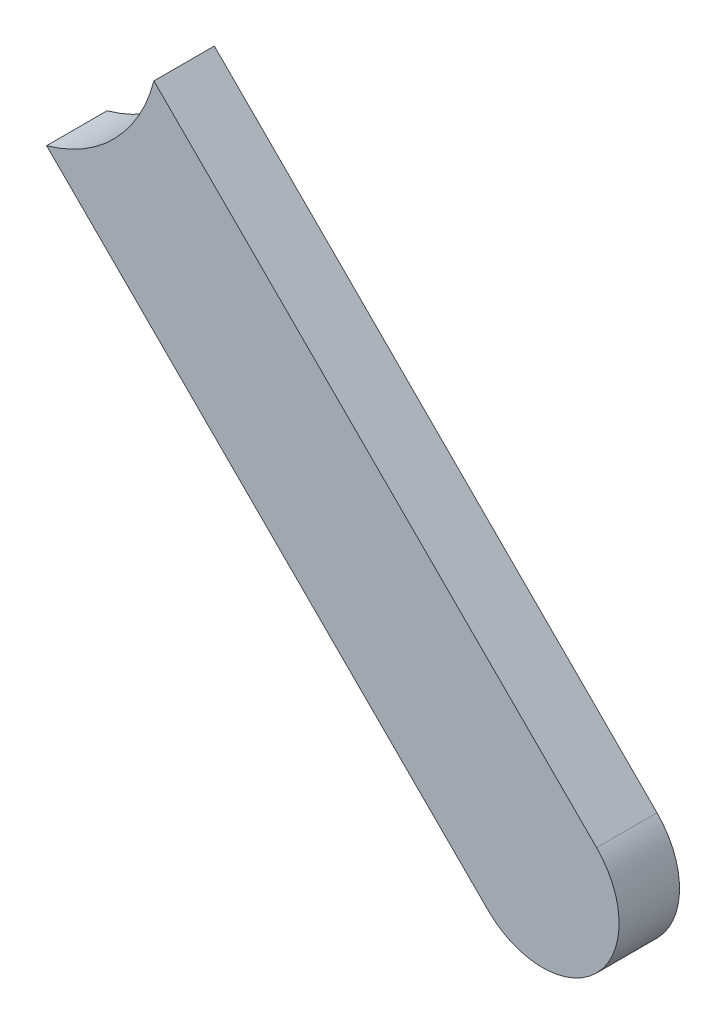
ISO-10303-21;
HEADER;
FILE_DESCRIPTION(('STEP AP214'),'2;1');
FILE_NAME('part.step','',(''),(''),'','','');
FILE_SCHEMA(('AUTOMOTIVE_DESIGN { 1 0 10303 214 1 1 1 1 }'));
ENDSEC;
DATA;
#1=APPLICATION_CONTEXT('core data for automotive mechanical design processes');
#2=APPLICATION_PROTOCOL_DEFINITION('international standard','automotive_design',2000,#1);
#3=PRODUCT_CONTEXT('',#1,'mechanical');
#4=PRODUCT('Part','Part','',(#3));
#5=PRODUCT_RELATED_PRODUCT_CATEGORY('part','',(#4));
#6=PRODUCT_DEFINITION_FORMATION('','',#4);
#7=PRODUCT_DEFINITION_CONTEXT('part definition',#1,'design');
#8=PRODUCT_DEFINITION('design','',#6,#7);
#9=PRODUCT_DEFINITION_SHAPE('','',#8);
#10=(LENGTH_UNIT() NAMED_UNIT(*) SI_UNIT(.MILLI.,.METRE.));
#11=(NAMED_UNIT(*) PLANE_ANGLE_UNIT() SI_UNIT($,.RADIAN.));
#12=(NAMED_UNIT(*) SI_UNIT($,.STERADIAN.) SOLID_ANGLE_UNIT());
#13=UNCERTAINTY_MEASURE_WITH_UNIT(LENGTH_MEASURE(1.E-05),#10,'distance_accuracy_value','');
#14=(GEOMETRIC_REPRESENTATION_CONTEXT(3) GLOBAL_UNCERTAINTY_ASSIGNED_CONTEXT((#13)) GLOBAL_UNIT_ASSIGNED_CONTEXT((#10,
#11,#12)) REPRESENTATION_CONTEXT('',''));
#15=CARTESIAN_POINT('',(0.,0.,0.));
#16=DIRECTION('',(0.,0.,1.));
#17=DIRECTION('',(1.,0.,0.));
#18=AXIS2_PLACEMENT_3D('',#15,#16,#17);
#19=CARTESIAN_POINT('',(90.3070192657488,57.2053527142512,0.));
#20=DIRECTION('',(0.707106781186548,0.707106781186548,0.));
#21=DIRECTION('',(0.707106781186548,-0.707106781186548,0.));
#22=AXIS2_PLACEMENT_3D('',#19,#20,#21);
#23=PLANE('',#22);
#24=DIRECTION('',(0.707106781186548,-0.707106781186548,0.));
#25=VECTOR('',#24,1.);
#26=CARTESIAN_POINT('',(89.99745272,57.51491926,0.1999996));
#27=LINE('',#26,#25);
#28=CARTESIAN_POINT('',(90.3070192657488,57.2053527142512,0.1999996));
#29=VERTEX_POINT('',#28);
#30=CARTESIAN_POINT('',(91.76839406,55.74397792,0.1999996));
#31=VERTEX_POINT('',#30);
#32=EDGE_CURVE('E11',#29,#31,#27,.T.);
#33=ORIENTED_EDGE('',*,*,#32,.F.);
#34=DIRECTION('',(0.,0.,1.));
#35=VECTOR('',#34,1.);
#36=CARTESIAN_POINT('',(90.3070192657488,57.2053527142512,0.));
#37=LINE('',#36,#35);
#38=CARTESIAN_POINT('',(90.3070192657488,57.2053527142512,0.));
#39=VERTEX_POINT('',#38);
#40=EDGE_CURVE('E24',#39,#29,#37,.T.);
#41=ORIENTED_EDGE('',*,*,#40,.F.);
#42=DIRECTION('',(0.707106781186548,-0.707106781186548,0.));
#43=VECTOR('',#42,1.);
#44=CARTESIAN_POINT('',(89.99745272,57.51491926,0.));
#45=LINE('',#44,#43);
#46=CARTESIAN_POINT('',(91.76839406,55.74397792,0.));
#47=VERTEX_POINT('',#46);
#48=EDGE_CURVE('E75',#39,#47,#45,.T.);
#49=ORIENTED_EDGE('',*,*,#48,.T.);
#50=DIRECTION('',(0.,0.,1.));
#51=VECTOR('',#50,1.);
#52=CARTESIAN_POINT('',(91.76839406,55.74397792,0.));
#53=LINE('',#52,#51);
#54=EDGE_CURVE('E37',#47,#31,#53,.T.);
#55=ORIENTED_EDGE('',*,*,#54,.T.);
#56=EDGE_LOOP('',(#33,#41,#49,#55));
#57=FACE_BOUND('',#56,.T.);
#58=ADVANCED_FACE('F17',(#57),#23,.F.);
#59=CARTESIAN_POINT('',(91.94799873,55.92358259,0.));
#60=DIRECTION('',(0.,0.,-1.));
#61=DIRECTION('',(-0.707106781186562,-0.707106781186534,0.));
#62=AXIS2_PLACEMENT_3D('',#59,#60,#61);
#63=CYLINDRICAL_SURFACE('',#62,0.253999360179546);
#64=CARTESIAN_POINT('',(91.94799873,55.92358259,0.1999996));
#65=DIRECTION('',(0.,0.,1.));
#66=DIRECTION('',(-0.707106781186562,-0.707106781186534,0.));
#67=AXIS2_PLACEMENT_3D('',#64,#65,#66);
#68=CIRCLE('',#67,0.253999360179546);
#69=CARTESIAN_POINT('',(92.1276034,56.10318726,0.1999996));
#70=VERTEX_POINT('',#69);
#71=EDGE_CURVE('E83',#31,#70,#68,.T.);
#72=ORIENTED_EDGE('',*,*,#71,.F.);
#73=ORIENTED_EDGE('',*,*,#54,.F.);
#74=CARTESIAN_POINT('',(91.94799873,55.92358259,0.));
#75=DIRECTION('',(0.,0.,1.));
#76=DIRECTION('',(-0.707106781186562,-0.707106781186534,0.));
#77=AXIS2_PLACEMENT_3D('',#74,#75,#76);
#78=CIRCLE('',#77,0.253999360179546);
#79=CARTESIAN_POINT('',(92.1276034,56.10318726,0.));
#80=VERTEX_POINT('',#79);
#81=EDGE_CURVE('E81',#47,#80,#78,.T.);
#82=ORIENTED_EDGE('',*,*,#81,.T.);
#83=DIRECTION('',(0.,0.,1.));
#84=VECTOR('',#83,1.);
#85=CARTESIAN_POINT('',(92.1276034,56.10318726,0.));
#86=LINE('',#85,#84);
#87=EDGE_CURVE('E67',#80,#70,#86,.T.);
#88=ORIENTED_EDGE('',*,*,#87,.T.);
#89=EDGE_LOOP('',(#72,#73,#82,#88));
#90=FACE_BOUND('',#89,.T.);
#91=ADVANCED_FACE('F89',(#90),#63,.T.);
#92=CARTESIAN_POINT('',(92.1276034,56.10318726,0.));
#93=DIRECTION('',(-0.707106781186546,-0.707106781186549,0.));
#94=DIRECTION('',(-0.707106781186549,0.707106781186546,0.));
#95=AXIS2_PLACEMENT_3D('',#92,#93,#94);
#96=PLANE('',#95);
#97=DIRECTION('',(-0.707106781186549,0.707106781186546,0.));
#98=VECTOR('',#97,1.);
#99=CARTESIAN_POINT('',(92.1276034,56.10318726,0.1999996));
#100=LINE('',#99,#98);
#101=CARTESIAN_POINT('',(90.6621544172693,57.5686362427307,0.1999996));
#102=VERTEX_POINT('',#101);
#103=EDGE_CURVE('E71',#70,#102,#100,.T.);
#104=ORIENTED_EDGE('',*,*,#103,.F.);
#105=ORIENTED_EDGE('',*,*,#87,.F.);
#106=DIRECTION('',(-0.707106781186549,0.707106781186546,0.));
#107=VECTOR('',#106,1.);
#108=CARTESIAN_POINT('',(92.1276034,56.10318726,0.));
#109=LINE('',#108,#107);
#110=CARTESIAN_POINT('',(90.6621544172693,57.5686362427307,0.));
#111=VERTEX_POINT('',#110);
#112=EDGE_CURVE('E63',#80,#111,#109,.T.);
#113=ORIENTED_EDGE('',*,*,#112,.T.);
#114=DIRECTION('',(0.,0.,1.));
#115=VECTOR('',#114,1.);
#116=CARTESIAN_POINT('',(90.6621544172693,57.5686362427307,0.));
#117=LINE('',#116,#115);
#118=EDGE_CURVE('E53',#111,#102,#117,.T.);
#119=ORIENTED_EDGE('',*,*,#118,.T.);
#120=EDGE_LOOP('',(#104,#105,#113,#119));
#121=FACE_BOUND('',#120,.T.);
#122=ADVANCED_FACE('F66',(#121),#96,.F.);
#123=CARTESIAN_POINT('',(90.17,57.6945252,0.));
#124=DIRECTION('',(0.,0.,-1.));
#125=DIRECTION('',(1.,0.,0.));
#126=AXIS2_PLACEMENT_3D('',#123,#124,#125);
#127=CYLINDRICAL_SURFACE('',#126,0.508);
#128=ORIENTED_EDGE('',*,*,#40,.T.);
#129=CARTESIAN_POINT('',(90.17,57.6945252,0.1999996));
#130=DIRECTION('',(0.,0.,1.));
#131=DIRECTION('',(1.,0.,0.));
#132=AXIS2_PLACEMENT_3D('',#129,#130,#131);
#133=CIRCLE('',#132,0.508);
#134=EDGE_CURVE('E59',#29,#102,#133,.T.);
#135=ORIENTED_EDGE('',*,*,#134,.T.);
#136=ORIENTED_EDGE('',*,*,#118,.F.);
#137=CARTESIAN_POINT('',(90.17,57.6945252,0.));
#138=DIRECTION('',(0.,0.,1.));
#139=DIRECTION('',(1.,0.,0.));
#140=AXIS2_PLACEMENT_3D('',#137,#138,#139);
#141=CIRCLE('',#140,0.508);
#142=EDGE_CURVE('E57',#39,#111,#141,.T.);
#143=ORIENTED_EDGE('',*,*,#142,.F.);
#144=EDGE_LOOP('',(#128,#135,#136,#143));
#145=FACE_BOUND('',#144,.T.);
#146=ADVANCED_FACE('F55',(#145),#127,.F.);
#147=CARTESIAN_POINT('',(89.99745272,57.51491926,0.));
#148=DIRECTION('',(0.,0.,-1.));
#149=DIRECTION('',(-1.,0.,0.));
#150=AXIS2_PLACEMENT_3D('',#147,#148,#149);
#151=PLANE('',#150);
#152=ORIENTED_EDGE('',*,*,#48,.F.);
#153=ORIENTED_EDGE('',*,*,#142,.T.);
#154=ORIENTED_EDGE('',*,*,#112,.F.);
#155=ORIENTED_EDGE('',*,*,#81,.F.);
#156=EDGE_LOOP('',(#152,#153,#154,#155));
#157=FACE_BOUND('',#156,.T.);
#158=ADVANCED_FACE('F74',(#157),#151,.T.);
#159=CARTESIAN_POINT('',(89.99745272,57.51491926,0.1999996));
#160=DIRECTION('',(0.,0.,-1.));
#161=DIRECTION('',(-1.,0.,0.));
#162=AXIS2_PLACEMENT_3D('',#159,#160,#161);
#163=PLANE('',#162);
#164=ORIENTED_EDGE('',*,*,#134,.F.);
#165=ORIENTED_EDGE('',*,*,#32,.T.);
#166=ORIENTED_EDGE('',*,*,#71,.T.);
#167=ORIENTED_EDGE('',*,*,#103,.T.);
#168=EDGE_LOOP('',(#164,#165,#166,#167));
#169=FACE_BOUND('',#168,.T.);
#170=ADVANCED_FACE('F91',(#169),#163,.F.);
#171=CLOSED_SHELL('',(#58,#91,#122,#146,#158,#170));
#172=MANIFOLD_SOLID_BREP('B1',#171);
#173=ADVANCED_BREP_SHAPE_REPRESENTATION('',(#18,#172),#14);
#174=SHAPE_DEFINITION_REPRESENTATION(#9,#173);
ENDSEC;
END-ISO-10303-21;
